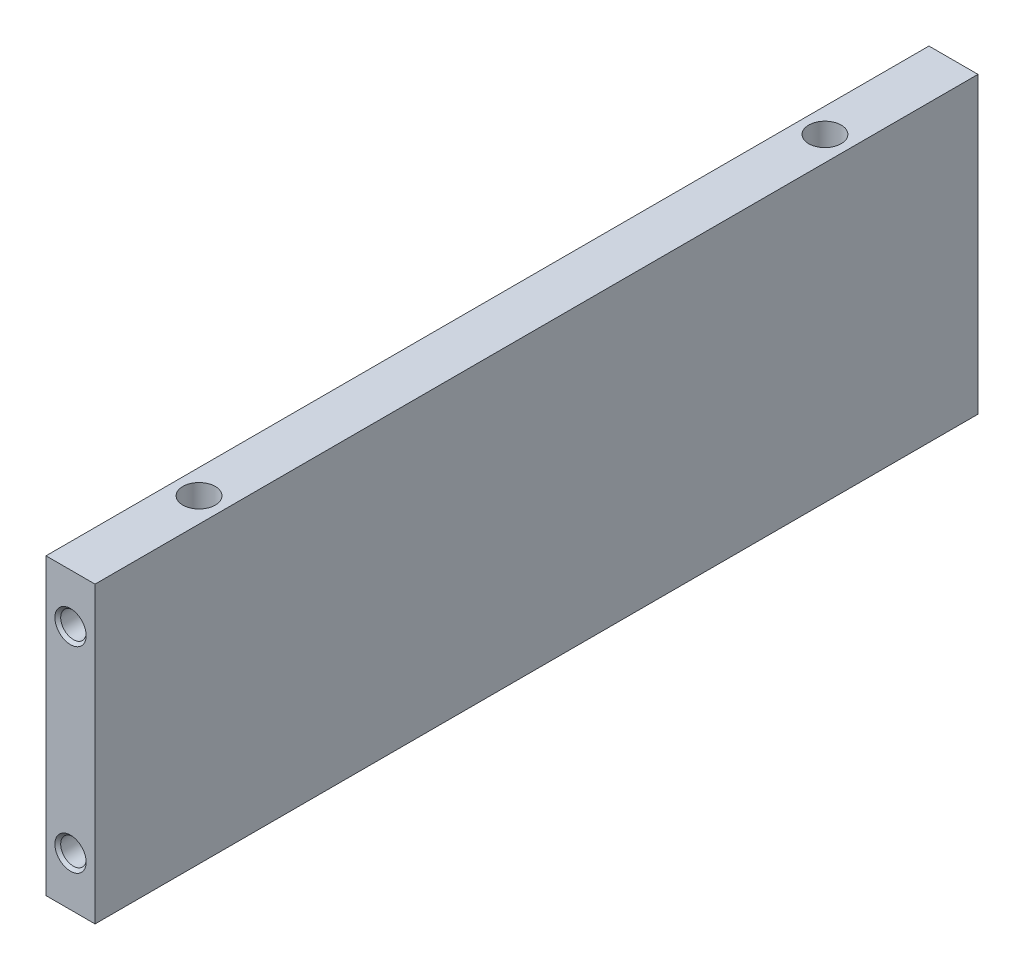
ISO-10303-21;
HEADER;
FILE_DESCRIPTION(('STEP AP214'),'2;1');
FILE_NAME('part.step','',(''),(''),'','','');
FILE_SCHEMA(('AUTOMOTIVE_DESIGN { 1 0 10303 214 1 1 1 1 }'));
ENDSEC;
DATA;
#1=APPLICATION_CONTEXT('core data for automotive mechanical design processes');
#2=APPLICATION_PROTOCOL_DEFINITION('international standard','automotive_design',2000,#1);
#3=PRODUCT_CONTEXT('',#1,'mechanical');
#4=PRODUCT('Part','Part','',(#3));
#5=PRODUCT_RELATED_PRODUCT_CATEGORY('part','',(#4));
#6=PRODUCT_DEFINITION_FORMATION('','',#4);
#7=PRODUCT_DEFINITION_CONTEXT('part definition',#1,'design');
#8=PRODUCT_DEFINITION('design','',#6,#7);
#9=PRODUCT_DEFINITION_SHAPE('','',#8);
#10=(LENGTH_UNIT() NAMED_UNIT(*) SI_UNIT(.MILLI.,.METRE.));
#11=(NAMED_UNIT(*) PLANE_ANGLE_UNIT() SI_UNIT($,.RADIAN.));
#12=(NAMED_UNIT(*) SI_UNIT($,.STERADIAN.) SOLID_ANGLE_UNIT());
#13=UNCERTAINTY_MEASURE_WITH_UNIT(LENGTH_MEASURE(1.E-05),#10,'distance_accuracy_value','');
#14=(GEOMETRIC_REPRESENTATION_CONTEXT(3) GLOBAL_UNCERTAINTY_ASSIGNED_CONTEXT((#13)) GLOBAL_UNIT_ASSIGNED_CONTEXT((#10,
#11,#12)) REPRESENTATION_CONTEXT('',''));
#15=CARTESIAN_POINT('',(0.,0.,0.));
#16=DIRECTION('',(0.,0.,1.));
#17=DIRECTION('',(1.,0.,0.));
#18=AXIS2_PLACEMENT_3D('',#15,#16,#17);
#19=CARTESIAN_POINT('',(3.175,19.05,-57.15));
#20=DIRECTION('',(1.,0.,0.));
#21=DIRECTION('',(0.,1.,0.));
#22=AXIS2_PLACEMENT_3D('',#19,#20,#21);
#23=PLANE('',#22);
#24=DIRECTION('',(0.,0.,1.));
#25=VECTOR('',#24,1.);
#26=CARTESIAN_POINT('',(3.175,19.05,-57.15));
#27=LINE('',#26,#25);
#28=CARTESIAN_POINT('',(3.175,19.05,-57.15));
#29=VERTEX_POINT('',#28);
#30=CARTESIAN_POINT('',(3.175,19.05,57.15));
#31=VERTEX_POINT('',#30);
#32=EDGE_CURVE('E54',#29,#31,#27,.T.);
#33=ORIENTED_EDGE('',*,*,#32,.T.);
#34=DIRECTION('',(0.,1.,0.));
#35=VECTOR('',#34,1.);
#36=CARTESIAN_POINT('',(3.175,19.05,57.15));
#37=LINE('',#36,#35);
#38=CARTESIAN_POINT('',(3.175,-19.05,57.15));
#39=VERTEX_POINT('',#38);
#40=EDGE_CURVE('E92',#39,#31,#37,.T.);
#41=ORIENTED_EDGE('',*,*,#40,.F.);
#42=DIRECTION('',(0.,0.,1.));
#43=VECTOR('',#42,1.);
#44=CARTESIAN_POINT('',(3.175,-19.05,-57.15));
#45=LINE('',#44,#43);
#46=CARTESIAN_POINT('',(3.175,-19.05,-57.15));
#47=VERTEX_POINT('',#46);
#48=EDGE_CURVE('E11',#47,#39,#45,.T.);
#49=ORIENTED_EDGE('',*,*,#48,.F.);
#50=DIRECTION('',(0.,1.,0.));
#51=VECTOR('',#50,1.);
#52=CARTESIAN_POINT('',(3.175,19.05,-57.15));
#53=LINE('',#52,#51);
#54=EDGE_CURVE('E93',#47,#29,#53,.T.);
#55=ORIENTED_EDGE('',*,*,#54,.T.);
#56=EDGE_LOOP('',(#33,#41,#49,#55));
#57=FACE_BOUND('',#56,.T.);
#58=ADVANCED_FACE('F51',(#57),#23,.T.);
#59=CARTESIAN_POINT('',(-3.175,-19.05,-57.15));
#60=DIRECTION('',(0.,-1.,0.));
#61=DIRECTION('',(0.,0.,-1.));
#62=AXIS2_PLACEMENT_3D('',#59,#60,#61);
#63=PLANE('',#62);
#64=CARTESIAN_POINT('',(0.,-19.05,40.513));
#65=DIRECTION('',(0.,1.,0.));
#66=DIRECTION('',(0.,0.,1.));
#67=AXIS2_PLACEMENT_3D('',#64,#65,#66);
#68=CIRCLE('',#67,2.1);
#69=CARTESIAN_POINT('',(0.,-19.05,42.613));
#70=VERTEX_POINT('',#69);
#71=EDGE_CURVE('E113',#70,#70,#68,.T.);
#72=ORIENTED_EDGE('',*,*,#71,.T.);
#73=EDGE_LOOP('',(#72));
#74=FACE_BOUND('',#73,.T.);
#75=CARTESIAN_POINT('',(0.,-19.05,-40.513));
#76=DIRECTION('',(0.,1.,0.));
#77=DIRECTION('',(0.,0.,1.));
#78=AXIS2_PLACEMENT_3D('',#75,#76,#77);
#79=CIRCLE('',#78,2.1);
#80=CARTESIAN_POINT('',(0.,-19.05,-38.413));
#81=VERTEX_POINT('',#80);
#82=EDGE_CURVE('E122',#81,#81,#79,.T.);
#83=ORIENTED_EDGE('',*,*,#82,.T.);
#84=EDGE_LOOP('',(#83));
#85=FACE_BOUND('',#84,.T.);
#86=ORIENTED_EDGE('',*,*,#48,.T.);
#87=DIRECTION('',(1.,0.,0.));
#88=VECTOR('',#87,1.);
#89=CARTESIAN_POINT('',(-3.175,-19.05,57.15));
#90=LINE('',#89,#88);
#91=CARTESIAN_POINT('',(-3.175,-19.05,57.15));
#92=VERTEX_POINT('',#91);
#93=EDGE_CURVE('E111',#92,#39,#90,.T.);
#94=ORIENTED_EDGE('',*,*,#93,.F.);
#95=DIRECTION('',(0.,0.,1.));
#96=VECTOR('',#95,1.);
#97=CARTESIAN_POINT('',(-3.175,-19.05,-57.15));
#98=LINE('',#97,#96);
#99=CARTESIAN_POINT('',(-3.175,-19.05,-57.15));
#100=VERTEX_POINT('',#99);
#101=EDGE_CURVE('E60',#100,#92,#98,.T.);
#102=ORIENTED_EDGE('',*,*,#101,.F.);
#103=DIRECTION('',(1.,0.,0.));
#104=VECTOR('',#103,1.);
#105=CARTESIAN_POINT('',(-3.175,-19.05,-57.15));
#106=LINE('',#105,#104);
#107=EDGE_CURVE('E99',#100,#47,#106,.T.);
#108=ORIENTED_EDGE('',*,*,#107,.T.);
#109=EDGE_LOOP('',(#86,#94,#102,#108));
#110=FACE_BOUND('',#109,.T.);
#111=ADVANCED_FACE('F271',(#74,#85,#110),#63,.T.);
#112=CARTESIAN_POINT('',(-3.175,19.05,-57.15));
#113=DIRECTION('',(-1.,0.,0.));
#114=DIRECTION('',(0.,-1.,0.));
#115=AXIS2_PLACEMENT_3D('',#112,#113,#114);
#116=PLANE('',#115);
#117=ORIENTED_EDGE('',*,*,#101,.T.);
#118=DIRECTION('',(0.,-1.,0.));
#119=VECTOR('',#118,1.);
#120=CARTESIAN_POINT('',(-3.175,19.05,57.15));
#121=LINE('',#120,#119);
#122=CARTESIAN_POINT('',(-3.175,19.05,57.15));
#123=VERTEX_POINT('',#122);
#124=EDGE_CURVE('E107',#123,#92,#121,.T.);
#125=ORIENTED_EDGE('',*,*,#124,.F.);
#126=DIRECTION('',(0.,0.,1.));
#127=VECTOR('',#126,1.);
#128=CARTESIAN_POINT('',(-3.175,19.05,-57.15));
#129=LINE('',#128,#127);
#130=CARTESIAN_POINT('',(-3.175,19.05,-57.15));
#131=VERTEX_POINT('',#130);
#132=EDGE_CURVE('E98',#131,#123,#129,.T.);
#133=ORIENTED_EDGE('',*,*,#132,.F.);
#134=DIRECTION('',(0.,-1.,0.));
#135=VECTOR('',#134,1.);
#136=CARTESIAN_POINT('',(-3.175,19.05,-57.15));
#137=LINE('',#136,#135);
#138=EDGE_CURVE('E134',#131,#100,#137,.T.);
#139=ORIENTED_EDGE('',*,*,#138,.T.);
#140=EDGE_LOOP('',(#117,#125,#133,#139));
#141=FACE_BOUND('',#140,.T.);
#142=ADVANCED_FACE('F275',(#141),#116,.T.);
#143=CARTESIAN_POINT('',(-3.175,19.05,-57.15));
#144=DIRECTION('',(0.,1.,0.));
#145=DIRECTION('',(0.,0.,1.));
#146=AXIS2_PLACEMENT_3D('',#143,#144,#145);
#147=PLANE('',#146);
#148=CARTESIAN_POINT('',(0.,19.05,40.513));
#149=DIRECTION('',(0.,1.,0.));
#150=DIRECTION('',(0.,0.,1.));
#151=AXIS2_PLACEMENT_3D('',#148,#149,#150);
#152=CIRCLE('',#151,2.1);
#153=CARTESIAN_POINT('',(0.,19.05,42.613));
#154=VERTEX_POINT('',#153);
#155=EDGE_CURVE('E119',#154,#154,#152,.T.);
#156=ORIENTED_EDGE('',*,*,#155,.F.);
#157=EDGE_LOOP('',(#156));
#158=FACE_BOUND('',#157,.T.);
#159=CARTESIAN_POINT('',(0.,19.05,-40.513));
#160=DIRECTION('',(0.,1.,0.));
#161=DIRECTION('',(0.,0.,1.));
#162=AXIS2_PLACEMENT_3D('',#159,#160,#161);
#163=CIRCLE('',#162,2.1);
#164=CARTESIAN_POINT('',(0.,19.05,-38.413));
#165=VERTEX_POINT('',#164);
#166=EDGE_CURVE('E167',#165,#165,#163,.T.);
#167=ORIENTED_EDGE('',*,*,#166,.F.);
#168=EDGE_LOOP('',(#167));
#169=FACE_BOUND('',#168,.T.);
#170=ORIENTED_EDGE('',*,*,#132,.T.);
#171=DIRECTION('',(-1.,0.,0.));
#172=VECTOR('',#171,1.);
#173=CARTESIAN_POINT('',(-3.175,19.05,57.15));
#174=LINE('',#173,#172);
#175=EDGE_CURVE('E101',#31,#123,#174,.T.);
#176=ORIENTED_EDGE('',*,*,#175,.F.);
#177=ORIENTED_EDGE('',*,*,#32,.F.);
#178=DIRECTION('',(-1.,0.,0.));
#179=VECTOR('',#178,1.);
#180=CARTESIAN_POINT('',(-3.175,19.05,-57.15));
#181=LINE('',#180,#179);
#182=EDGE_CURVE('E131',#29,#131,#181,.T.);
#183=ORIENTED_EDGE('',*,*,#182,.T.);
#184=EDGE_LOOP('',(#170,#176,#177,#183));
#185=FACE_BOUND('',#184,.T.);
#186=ADVANCED_FACE('F102',(#158,#169,#185),#147,.T.);
#187=CARTESIAN_POINT('',(0.,0.,-57.15));
#188=DIRECTION('',(0.,0.,1.));
#189=DIRECTION('',(1.,0.,0.));
#190=AXIS2_PLACEMENT_3D('',#187,#188,#189);
#191=PLANE('',#190);
#192=CARTESIAN_POINT('',(0.,12.7,-57.15));
#193=DIRECTION('',(0.,0.,-1.));
#194=DIRECTION('',(-1.,0.,0.));
#195=AXIS2_PLACEMENT_3D('',#192,#193,#194);
#196=CIRCLE('',#195,2.025);
#197=CARTESIAN_POINT('',(-2.025,12.7,-57.15));
#198=VERTEX_POINT('',#197);
#199=EDGE_CURVE('E242',#198,#198,#196,.T.);
#200=ORIENTED_EDGE('',*,*,#199,.F.);
#201=EDGE_LOOP('',(#200));
#202=FACE_BOUND('',#201,.T.);
#203=CARTESIAN_POINT('',(0.,-12.7,-57.15));
#204=DIRECTION('',(0.,0.,-1.));
#205=DIRECTION('',(-1.,0.,0.));
#206=AXIS2_PLACEMENT_3D('',#203,#204,#205);
#207=CIRCLE('',#206,2.025);
#208=CARTESIAN_POINT('',(-2.025,-12.7,-57.15));
#209=VERTEX_POINT('',#208);
#210=EDGE_CURVE('E224',#209,#209,#207,.T.);
#211=ORIENTED_EDGE('',*,*,#210,.F.);
#212=EDGE_LOOP('',(#211));
#213=FACE_BOUND('',#212,.T.);
#214=ORIENTED_EDGE('',*,*,#54,.F.);
#215=ORIENTED_EDGE('',*,*,#107,.F.);
#216=ORIENTED_EDGE('',*,*,#138,.F.);
#217=ORIENTED_EDGE('',*,*,#182,.F.);
#218=EDGE_LOOP('',(#214,#215,#216,#217));
#219=FACE_BOUND('',#218,.T.);
#220=ADVANCED_FACE('F285',(#202,#213,#219),#191,.F.);
#221=CARTESIAN_POINT('',(0.,0.,57.15));
#222=DIRECTION('',(0.,0.,1.));
#223=DIRECTION('',(1.,0.,0.));
#224=AXIS2_PLACEMENT_3D('',#221,#222,#223);
#225=PLANE('',#224);
#226=CARTESIAN_POINT('',(0.,12.7,57.15));
#227=DIRECTION('',(0.,0.,1.));
#228=DIRECTION('',(1.,0.,0.));
#229=AXIS2_PLACEMENT_3D('',#226,#227,#228);
#230=CIRCLE('',#229,2.025);
#231=CARTESIAN_POINT('',(2.025,12.7,57.15));
#232=VERTEX_POINT('',#231);
#233=EDGE_CURVE('E206',#232,#232,#230,.T.);
#234=ORIENTED_EDGE('',*,*,#233,.F.);
#235=EDGE_LOOP('',(#234));
#236=FACE_BOUND('',#235,.T.);
#237=CARTESIAN_POINT('',(0.,-12.7,57.15));
#238=DIRECTION('',(0.,0.,1.));
#239=DIRECTION('',(1.,0.,0.));
#240=AXIS2_PLACEMENT_3D('',#237,#238,#239);
#241=CIRCLE('',#240,2.025);
#242=CARTESIAN_POINT('',(2.025,-12.7,57.15));
#243=VERTEX_POINT('',#242);
#244=EDGE_CURVE('E188',#243,#243,#241,.T.);
#245=ORIENTED_EDGE('',*,*,#244,.F.);
#246=EDGE_LOOP('',(#245));
#247=FACE_BOUND('',#246,.T.);
#248=ORIENTED_EDGE('',*,*,#40,.T.);
#249=ORIENTED_EDGE('',*,*,#175,.T.);
#250=ORIENTED_EDGE('',*,*,#124,.T.);
#251=ORIENTED_EDGE('',*,*,#93,.T.);
#252=EDGE_LOOP('',(#248,#249,#250,#251));
#253=FACE_BOUND('',#252,.T.);
#254=ADVANCED_FACE('F110',(#236,#247,#253),#225,.T.);
#255=CARTESIAN_POINT('',(0.,-19.05,-40.513));
#256=DIRECTION('',(0.,1.,0.));
#257=DIRECTION('',(0.,0.,1.));
#258=AXIS2_PLACEMENT_3D('',#255,#256,#257);
#259=CYLINDRICAL_SURFACE('',#258,2.1);
#260=CARTESIAN_POINT('',(-1.65,12.7,-41.8120381056767));
#261=CARTESIAN_POINT('',(-1.64999150232253,12.7633907031737,-41.8120565708423));
#262=CARTESIAN_POINT('',(-1.64630541944785,12.8268781383126,-41.8167734895458));
#263=CARTESIAN_POINT('',(-1.63188621414006,12.9518827753618,-41.8347663632729));
#264=CARTESIAN_POINT('',(-1.6211295493421,13.0133926726387,-41.8480709091701));
#265=CARTESIAN_POINT('',(-1.58869701304661,13.1530488771155,-41.8866297412798));
#266=CARTESIAN_POINT('',(-1.5645783687287,13.2299177508478,-41.9143875294822));
#267=CARTESIAN_POINT('',(-1.50673755099663,13.3771525366048,-41.9764019107869));
#268=CARTESIAN_POINT('',(-1.47298961775175,13.4475003257843,-42.0106758524145));
#269=CARTESIAN_POINT('',(-1.38411832769514,13.6040423341345,-42.0938350740011));
#270=CARTESIAN_POINT('',(-1.32561785872244,13.6877527092149,-42.1437959226138));
#271=CARTESIAN_POINT('',(-1.19394013201228,13.8434036827777,-42.24253553492));
#272=CARTESIAN_POINT('',(-1.12077463856696,13.9153536320215,-42.2913152112187));
#273=CARTESIAN_POINT('',(-0.975495005805126,14.0333812365183,-42.3741851132311));
#274=CARTESIAN_POINT('',(-0.905854798310287,14.0817753557718,-42.4093006712452));
#275=CARTESIAN_POINT('',(-0.7577844041816,14.1681903760097,-42.4731620444215));
#276=CARTESIAN_POINT('',(-0.679367851793273,14.2062270603499,-42.5019175387774));
#277=CARTESIAN_POINT('',(-0.528017404110454,14.2649961623543,-42.5468179099653));
#278=CARTESIAN_POINT('',(-0.456155802714711,14.2875078344728,-42.5642338935184));
#279=CARTESIAN_POINT('',(-0.308663596325365,14.3226403395103,-42.5915422869353));
#280=CARTESIAN_POINT('',(-0.233035031158962,14.3352664648751,-42.6014387224712));
#281=CARTESIAN_POINT('',(-0.0798699655767393,14.3498652688319,-42.6128891665015));
#282=CARTESIAN_POINT('',(-0.00232818004367965,14.3518040720613,-42.6144166480195));
#283=CARTESIAN_POINT('',(0.151953996536498,14.3448020790065,-42.608917281436));
#284=CARTESIAN_POINT('',(0.228694322819096,14.3358604102471,-42.6018897473312));
#285=CARTESIAN_POINT('',(0.375312888043239,14.3083943252109,-42.5804534122505));
#286=CARTESIAN_POINT('',(0.445342782688923,14.2903659450119,-42.5664270340302));
#287=CARTESIAN_POINT('',(0.58108275797318,14.2459456804528,-42.5322196008011));
#288=CARTESIAN_POINT('',(0.646791780509265,14.2195517566657,-42.5120370450293));
#289=CARTESIAN_POINT('',(0.779222926407902,14.1564407560638,-42.4644726926839));
#290=CARTESIAN_POINT('',(0.845389222472605,14.1189552835731,-42.4365727852921));
#291=CARTESIAN_POINT('',(0.970656409600608,14.0363991895378,-42.3765076565387));
#292=CARTESIAN_POINT('',(1.02975274570742,13.9913237225319,-42.3443397132573));
#293=CARTESIAN_POINT('',(1.15192072621684,13.884666766519,-42.2705979726863));
#294=CARTESIAN_POINT('',(1.2133394358136,13.8215943370514,-42.2284449226687));
#295=CARTESIAN_POINT('',(1.32533908018869,13.6867489499515,-42.1434647267489));
#296=CARTESIAN_POINT('',(1.3759088066046,13.6149671130918,-42.1006369323038));
#297=CARTESIAN_POINT('',(1.45976152704553,13.4729631229397,-42.0235945823214));
#298=CARTESIAN_POINT('',(1.49444438997018,13.4037820639662,-41.9889887308105));
#299=CARTESIAN_POINT('',(1.55441331240958,13.2589399207844,-41.9256903320215));
#300=CARTESIAN_POINT('',(1.57972010240787,13.1832935929339,-41.8969848025154));
#301=CARTESIAN_POINT('',(1.61414085002842,13.0472091085285,-41.8565257459194));
#302=CARTESIAN_POINT('',(1.62578097079893,12.9881689010386,-41.8422884088271));
#303=CARTESIAN_POINT('',(1.64255399692266,12.8678865722324,-41.821511149724));
#304=CARTESIAN_POINT('',(1.64769972998323,12.8066490380408,-41.8149560555916));
#305=CARTESIAN_POINT('',(1.65107138240099,12.6834019565507,-41.8106802990477));
#306=CARTESIAN_POINT('',(1.64926867496375,12.6213902668846,-41.8129961838294));
#307=CARTESIAN_POINT('',(1.63884970070072,12.4988284145099,-41.826101121331));
#308=CARTESIAN_POINT('',(1.63022334690548,12.4382805523469,-41.8369027177854));
#309=CARTESIAN_POINT('',(1.60338456249353,12.30286382475,-41.8693591127881));
#310=CARTESIAN_POINT('',(1.58311204846238,12.2289594944631,-41.8932585266264));
#311=CARTESIAN_POINT('',(1.53370076481959,12.086845846436,-41.9479640012219));
#312=CARTESIAN_POINT('',(1.50453477145501,12.0186548464198,-41.978791191243));
#313=CARTESIAN_POINT('',(1.42500843942745,11.8619242627284,-42.0568785540598));
#314=CARTESIAN_POINT('',(1.37083596883987,11.7761404865441,-42.1057832520841));
#315=CARTESIAN_POINT('',(1.24797292162134,11.6159152908317,-42.2037879721822));
#316=CARTESIAN_POINT('',(1.17928526066674,11.5414715985733,-42.2528879530889));
#317=CARTESIAN_POINT('',(1.0393011483464,11.4155546682969,-42.3393504756976));
#318=CARTESIAN_POINT('',(0.970005610597323,11.3623096578053,-42.3773603158094));
#319=CARTESIAN_POINT('',(0.82170315249813,11.2664487811213,-42.4472946816617));
#320=CARTESIAN_POINT('',(0.742712885609013,11.2238150582481,-42.4792294089619));
#321=CARTESIAN_POINT('',(0.590787802221573,11.1575714513305,-42.5294843212359));
#322=CARTESIAN_POINT('',(0.519203875806985,11.1319396738409,-42.5492080861349));
#323=CARTESIAN_POINT('',(0.371625061847246,11.0905732974517,-42.5812314394734));
#324=CARTESIAN_POINT('',(0.295632711102596,11.0748330670365,-42.5935352521238));
#325=CARTESIAN_POINT('',(0.140959211201724,11.0541751007247,-42.6097111569269));
#326=CARTESIAN_POINT('',(0.0622682663417694,11.0493022619967,-42.6135482693555));
#327=CARTESIAN_POINT('',(-0.0949302176673043,11.0508593787594,-42.6123247283874));
#328=CARTESIAN_POINT('',(-0.173437766871315,11.0572886993054,-42.6072645748307));
#329=CARTESIAN_POINT('',(-0.3225702794605,11.0801966543102,-42.5893470512292));
#330=CARTESIAN_POINT('',(-0.393371744151163,11.0959764142218,-42.5770322535849));
#331=CARTESIAN_POINT('',(-0.530991946642845,11.1361296845671,-42.545985170046));
#332=CARTESIAN_POINT('',(-0.597809716501815,11.1605052737123,-42.527251331879));
#333=CARTESIAN_POINT('',(-0.73158846101514,11.2191083842408,-42.4828083092122));
#334=CARTESIAN_POINT('',(-0.79811831489105,11.2539763663191,-42.4566554444437));
#335=CARTESIAN_POINT('',(-0.924472492076905,11.3312979065058,-42.399838116379));
#336=CARTESIAN_POINT('',(-0.984293520428327,11.3737551656737,-42.3691714531348));
#337=CARTESIAN_POINT('',(-1.10796891924142,11.4742567829222,-42.2986136271374));
#338=CARTESIAN_POINT('',(-1.17030553583476,11.533724608473,-42.258094028955));
#339=CARTESIAN_POINT('',(-1.28472853787868,11.6610979098706,-42.1756629615147));
#340=CARTESIAN_POINT('',(-1.33680152106845,11.7290142315781,-42.1337497548105));
#341=CARTESIAN_POINT('',(-1.42801952027212,11.8693805786131,-42.0538597093073));
#342=CARTESIAN_POINT('',(-1.46767106492228,11.9414481146506,-42.015790582789));
#343=CARTESIAN_POINT('',(-1.5365395713837,12.0930049093589,-41.9452934841617));
#344=CARTESIAN_POINT('',(-1.56577545027582,12.1724803788512,-41.9128553405145));
#345=CARTESIAN_POINT('',(-1.60539413851652,12.3141056947801,-41.8670118378246));
#346=CARTESIAN_POINT('',(-1.61879216518679,12.374489444246,-41.8508146535357));
#347=CARTESIAN_POINT('',(-1.6387476004762,12.4978412125655,-41.8263048398188));
#348=CARTESIAN_POINT('',(-1.64533080610612,12.560798541002,-41.8179624874273));
#349=CARTESIAN_POINT('',(-1.64941979861355,12.6493642059234,-41.8127732868244));
#350=CARTESIAN_POINT('',(-1.65000339496035,12.6746743831103,-41.8120307285427));
#351=CARTESIAN_POINT('',(-1.65,12.7,-41.8120381056767));
#352=B_SPLINE_CURVE_WITH_KNOTS('',3,(#260,#261,#262,#263,#264,#265,#266,#267,#268,#269,#270,
#271,#272,#273,#274,#275,#276,#277,#278,#279,#280,#281,#282,#283,#284,#285,#286,#287,#288,#289,
#290,#291,#292,#293,#294,#295,#296,#297,#298,#299,#300,#301,#302,#303,#304,#305,#306,#307,#308,
#309,#310,#311,#312,#313,#314,#315,#316,#317,#318,#319,#320,#321,#322,#323,#324,#325,#326,#327,
#328,#329,#330,#331,#332,#333,#334,#335,#336,#337,#338,#339,#340,#341,#342,#343,#344,#345,#346,
#347,#348,#349,#350,#351),.UNSPECIFIED.,.T.,.F.,(4,2,2,2,2,2,2,2,2,2,2,2,2,2,2,2,2,2,2,2,2,2,2,
2,2,2,2,2,2,2,2,2,2,2,2,2,2,2,2,2,2,2,2,2,2,4),(0.,0.190084746348346,0.380805630996544,
0.6350098053961,0.889900495479767,1.22933923087683,1.56850675033124,1.84282282531256,
2.11671850942991,2.3476099745084,2.57837774205232,2.80987655016042,3.04139392274665,
3.2614560345303,3.48157183634271,3.7237000741056,3.96598347697074,4.25774733977163,
4.54981119499563,4.80338572611547,5.05639621034818,5.24119722181751,5.42563264033953,
5.61082872264334,5.79629908148735,6.03578290391508,6.27600729540196,6.61221375790708,
6.94835275047202,7.23314990663923,7.51746451546374,7.75213593415367,7.986673626959,
8.22217849970153,8.45767014242528,8.6774548818802,8.89729280791383,9.13502647860396,
9.37287640265283,9.65746971154067,9.94243221578962,10.2135011668675,10.4840752582166,
10.6751900056936,10.8655786268932,10.941520574554),.UNSPECIFIED.);
#353=CARTESIAN_POINT('',(-1.65,12.7,-41.8120381056767));
#354=VERTEX_POINT('',#353);
#355=EDGE_CURVE('E230',#354,#354,#352,.T.);
#356=ORIENTED_EDGE('',*,*,#355,.T.);
#357=EDGE_LOOP('',(#356));
#358=FACE_BOUND('',#357,.T.);
#359=CARTESIAN_POINT('',(-1.65,-12.7,-41.8120381056766));
#360=CARTESIAN_POINT('',(-1.64999150232253,-12.6366092968263,-41.8120565708423));
#361=CARTESIAN_POINT('',(-1.64630541944785,-12.5731218616874,-41.8167734895458));
#362=CARTESIAN_POINT('',(-1.63188621414007,-12.4481172246382,-41.8347663632729));
#363=CARTESIAN_POINT('',(-1.6211295493421,-12.3866073273613,-41.8480709091701));
#364=CARTESIAN_POINT('',(-1.58869701304661,-12.2469511228845,-41.8866297412798));
#365=CARTESIAN_POINT('',(-1.5645783687287,-12.1700822491522,-41.9143875294822));
#366=CARTESIAN_POINT('',(-1.50673755099663,-12.0228474633952,-41.9764019107869));
#367=CARTESIAN_POINT('',(-1.47298961775175,-11.9524996742157,-42.0106758524145));
#368=CARTESIAN_POINT('',(-1.38411832769514,-11.7959576658655,-42.0938350740011));
#369=CARTESIAN_POINT('',(-1.32561785872243,-11.7122472907851,-42.1437959226138));
#370=CARTESIAN_POINT('',(-1.19394013201228,-11.5565963172223,-42.24253553492));
#371=CARTESIAN_POINT('',(-1.12077463856696,-11.4846463679785,-42.2913152112187));
#372=CARTESIAN_POINT('',(-0.97549500580512,-11.3666187634817,-42.3741851132311));
#373=CARTESIAN_POINT('',(-0.905854798310279,-11.3182246442282,-42.4093006712452));
#374=CARTESIAN_POINT('',(-0.757784404181593,-11.2318096239903,-42.4731620444215));
#375=CARTESIAN_POINT('',(-0.679367851793268,-11.1937729396501,-42.5019175387774));
#376=CARTESIAN_POINT('',(-0.52801740411045,-11.1350038376457,-42.5468179099653));
#377=CARTESIAN_POINT('',(-0.456155802714705,-11.1124921655272,-42.5642338935184));
#378=CARTESIAN_POINT('',(-0.308663596325359,-11.0773596604897,-42.5915422869353));
#379=CARTESIAN_POINT('',(-0.233035031158957,-11.0647335351249,-42.6014387224712));
#380=CARTESIAN_POINT('',(-0.079869965576734,-11.0501347311681,-42.6128891665015));
#381=CARTESIAN_POINT('',(-0.00232818004367465,-11.0481959279387,-42.6144166480195));
#382=CARTESIAN_POINT('',(0.151953996536503,-11.0551979209935,-42.608917281436));
#383=CARTESIAN_POINT('',(0.2286943228191,-11.0641395897529,-42.6018897473312));
#384=CARTESIAN_POINT('',(0.375312888043241,-11.0916056747891,-42.5804534122505));
#385=CARTESIAN_POINT('',(0.445342782688924,-11.1096340549881,-42.5664270340302));
#386=CARTESIAN_POINT('',(0.581082757973181,-11.1540543195472,-42.5322196008011));
#387=CARTESIAN_POINT('',(0.646791780509267,-11.1804482433343,-42.5120370450293));
#388=CARTESIAN_POINT('',(0.779222926407905,-11.2435592439362,-42.4644726926839));
#389=CARTESIAN_POINT('',(0.845389222472608,-11.2810447164269,-42.4365727852921));
#390=CARTESIAN_POINT('',(0.970656409600611,-11.3636008104622,-42.3765076565387));
#391=CARTESIAN_POINT('',(1.02975274570743,-11.4086762774681,-42.3443397132573));
#392=CARTESIAN_POINT('',(1.15192072621685,-11.515333233481,-42.2705979726863));
#393=CARTESIAN_POINT('',(1.2133394358136,-11.5784056629486,-42.2284449226687));
#394=CARTESIAN_POINT('',(1.32533908018869,-11.7132510500485,-42.1434647267489));
#395=CARTESIAN_POINT('',(1.3759088066046,-11.7850328869082,-42.1006369323038));
#396=CARTESIAN_POINT('',(1.45976152704553,-11.9270368770603,-42.0235945823214));
#397=CARTESIAN_POINT('',(1.49444438997018,-11.9962179360338,-41.9889887308105));
#398=CARTESIAN_POINT('',(1.55441331240958,-12.1410600792156,-41.9256903320215));
#399=CARTESIAN_POINT('',(1.57972010240787,-12.2167064070661,-41.8969848025154));
#400=CARTESIAN_POINT('',(1.61414085002842,-12.3527908914715,-41.8565257459194));
#401=CARTESIAN_POINT('',(1.62578097079892,-12.4118310989614,-41.8422884088271));
#402=CARTESIAN_POINT('',(1.64255399692266,-12.5321134277676,-41.821511149724));
#403=CARTESIAN_POINT('',(1.64769972998322,-12.5933509619593,-41.8149560555916));
#404=CARTESIAN_POINT('',(1.65107138240099,-12.7165980434493,-41.8106802990477));
#405=CARTESIAN_POINT('',(1.64926867496375,-12.7786097331154,-41.8129961838294));
#406=CARTESIAN_POINT('',(1.63884970070072,-12.9011715854901,-41.826101121331));
#407=CARTESIAN_POINT('',(1.63022334690548,-12.9617194476531,-41.8369027177854));
#408=CARTESIAN_POINT('',(1.60338456249353,-13.0971361752501,-41.8693591127881));
#409=CARTESIAN_POINT('',(1.58311204846238,-13.1710405055369,-41.8932585266264));
#410=CARTESIAN_POINT('',(1.53370076481959,-13.313154153564,-41.9479640012219));
#411=CARTESIAN_POINT('',(1.504534771455,-13.3813451535802,-41.978791191243));
#412=CARTESIAN_POINT('',(1.42500843942745,-13.5380757372716,-42.0568785540598));
#413=CARTESIAN_POINT('',(1.37083596883987,-13.6238595134559,-42.1057832520841));
#414=CARTESIAN_POINT('',(1.24797292162134,-13.7840847091683,-42.2037879721822));
#415=CARTESIAN_POINT('',(1.17928526066674,-13.8585284014267,-42.2528879530889));
#416=CARTESIAN_POINT('',(1.0393011483464,-13.9844453317031,-42.3393504756976));
#417=CARTESIAN_POINT('',(0.970005610597324,-14.0376903421947,-42.3773603158094));
#418=CARTESIAN_POINT('',(0.821703152498131,-14.1335512188787,-42.4472946816617));
#419=CARTESIAN_POINT('',(0.742712885609014,-14.1761849417519,-42.4792294089619));
#420=CARTESIAN_POINT('',(0.590787802221574,-14.2424285486695,-42.5294843212359));
#421=CARTESIAN_POINT('',(0.519203875806986,-14.2680603261591,-42.5492080861349));
#422=CARTESIAN_POINT('',(0.371625061847247,-14.3094267025483,-42.5812314394734));
#423=CARTESIAN_POINT('',(0.295632711102597,-14.3251669329635,-42.5935352521238));
#424=CARTESIAN_POINT('',(0.140959211201724,-14.3458248992753,-42.6097111569269));
#425=CARTESIAN_POINT('',(0.0622682663417701,-14.3506977380033,-42.6135482693555));
#426=CARTESIAN_POINT('',(-0.0949302176673037,-14.3491406212406,-42.6123247283874));
#427=CARTESIAN_POINT('',(-0.173437766871314,-14.3427113006946,-42.6072645748307));
#428=CARTESIAN_POINT('',(-0.3225702794605,-14.3198033456898,-42.5893470512292));
#429=CARTESIAN_POINT('',(-0.393371744151165,-14.3040235857782,-42.5770322535849));
#430=CARTESIAN_POINT('',(-0.530991946642847,-14.2638703154329,-42.545985170046));
#431=CARTESIAN_POINT('',(-0.597809716501816,-14.2394947262877,-42.527251331879));
#432=CARTESIAN_POINT('',(-0.73158846101514,-14.1808916157592,-42.4828083092122));
#433=CARTESIAN_POINT('',(-0.79811831489105,-14.1460236336809,-42.4566554444437));
#434=CARTESIAN_POINT('',(-0.924472492076905,-14.0687020934943,-42.399838116379));
#435=CARTESIAN_POINT('',(-0.984293520428328,-14.0262448343263,-42.3691714531348));
#436=CARTESIAN_POINT('',(-1.10796891924142,-13.9257432170778,-42.2986136271374));
#437=CARTESIAN_POINT('',(-1.17030553583476,-13.866275391527,-42.258094028955));
#438=CARTESIAN_POINT('',(-1.28472853787868,-13.7389020901294,-42.1756629615147));
#439=CARTESIAN_POINT('',(-1.33680152106845,-13.6709857684219,-42.1337497548105));
#440=CARTESIAN_POINT('',(-1.42801952027212,-13.5306194213869,-42.0538597093073));
#441=CARTESIAN_POINT('',(-1.46767106492229,-13.4585518853494,-42.015790582789));
#442=CARTESIAN_POINT('',(-1.53653957138371,-13.3069950906411,-41.9452934841617));
#443=CARTESIAN_POINT('',(-1.56577545027582,-13.2275196211487,-41.9128553405145));
#444=CARTESIAN_POINT('',(-1.60539413851652,-13.0858943052199,-41.8670118378246));
#445=CARTESIAN_POINT('',(-1.61879216518679,-13.025510555754,-41.8508146535357));
#446=CARTESIAN_POINT('',(-1.6387476004762,-12.9021587874345,-41.8263048398188));
#447=CARTESIAN_POINT('',(-1.64533080610613,-12.839201458998,-41.8179624874273));
#448=CARTESIAN_POINT('',(-1.64941979861355,-12.7506357940766,-41.8127732868244));
#449=CARTESIAN_POINT('',(-1.65000339496035,-12.7253256168897,-41.8120307285427));
#450=CARTESIAN_POINT('',(-1.65,-12.7,-41.8120381056766));
#451=B_SPLINE_CURVE_WITH_KNOTS('',3,(#359,#360,#361,#362,#363,#364,#365,#366,#367,#368,#369,
#370,#371,#372,#373,#374,#375,#376,#377,#378,#379,#380,#381,#382,#383,#384,#385,#386,#387,#388,
#389,#390,#391,#392,#393,#394,#395,#396,#397,#398,#399,#400,#401,#402,#403,#404,#405,#406,#407,
#408,#409,#410,#411,#412,#413,#414,#415,#416,#417,#418,#419,#420,#421,#422,#423,#424,#425,#426,
#427,#428,#429,#430,#431,#432,#433,#434,#435,#436,#437,#438,#439,#440,#441,#442,#443,#444,#445,
#446,#447,#448,#449,#450),.UNSPECIFIED.,.T.,.F.,(4,2,2,2,2,2,2,2,2,2,2,2,2,2,2,2,2,2,2,2,2,2,2,
2,2,2,2,2,2,2,2,2,2,2,2,2,2,2,2,2,2,2,2,2,2,4),(0.,0.190084746348344,0.380805630996544,
0.635009805396104,0.889900495479771,1.22933923087684,1.56850675033126,1.84282282531257,
2.11671850942992,2.3476099745084,2.57837774205233,2.80987655016043,3.04139392274666,
3.26145603453031,3.48157183634271,3.7237000741056,3.96598347697075,4.25774733977164,
4.54981119499563,4.80338572611547,5.05639621034818,5.24119722181751,5.42563264033953,
5.61082872264334,5.79629908148735,6.03578290391508,6.27600729540196,6.61221375790707,
6.94835275047201,7.23314990663922,7.51746451546374,7.75213593415367,7.986673626959,
8.22217849970152,8.45767014242528,8.67745488188019,8.89729280791383,9.13502647860396,
9.37287640265282,9.65746971154067,9.94243221578962,10.2135011668675,10.4840752582166,
10.6751900056936,10.8655786268932,10.941520574554),.UNSPECIFIED.);
#452=CARTESIAN_POINT('',(-1.65,-12.7,-41.8120381056766));
#453=VERTEX_POINT('',#452);
#454=EDGE_CURVE('E212',#453,#453,#451,.T.);
#455=ORIENTED_EDGE('',*,*,#454,.T.);
#456=EDGE_LOOP('',(#455));
#457=FACE_BOUND('',#456,.T.);
#458=ORIENTED_EDGE('',*,*,#82,.F.);
#459=EDGE_LOOP('',(#458));
#460=FACE_BOUND('',#459,.T.);
#461=ORIENTED_EDGE('',*,*,#166,.T.);
#462=EDGE_LOOP('',(#461));
#463=FACE_BOUND('',#462,.T.);
#464=ADVANCED_FACE('F297',(#358,#457,#460,#463),#259,.F.);
#465=CARTESIAN_POINT('',(0.,-19.05,40.513));
#466=DIRECTION('',(0.,1.,0.));
#467=DIRECTION('',(0.,0.,1.));
#468=AXIS2_PLACEMENT_3D('',#465,#466,#467);
#469=CYLINDRICAL_SURFACE('',#468,2.1);
#470=CARTESIAN_POINT('',(0.,11.05,42.613));
#471=CARTESIAN_POINT('',(0.079600191721892,11.0500063854919,42.6129938180354));
#472=CARTESIAN_POINT('',(0.159308770499117,11.055807247544,42.6084276883457));
#473=CARTESIAN_POINT('',(0.316170572494336,11.0786270272923,42.590571175364));
#474=CARTESIAN_POINT('',(0.393318112451336,11.0956693436557,42.5772625952266));
#475=CARTESIAN_POINT('',(0.54236813503901,11.1397625247728,42.5431838207728));
#476=CARTESIAN_POINT('',(0.614300091198767,11.166750872655,42.5224602573362));
#477=CARTESIAN_POINT('',(0.752077362908827,11.2294161337021,42.4750649728783));
#478=CARTESIAN_POINT('',(0.817922465170861,11.2650933511729,42.4483930435333));
#479=CARTESIAN_POINT('',(0.964068401518121,11.3572928882193,42.3809013584246));
#480=CARTESIAN_POINT('',(1.04169930716527,11.4167812548436,42.3383511025782));
#481=CARTESIAN_POINT('',(1.18434758790923,11.5470916136396,42.2492096979225));
#482=CARTESIAN_POINT('',(1.24932779180486,11.6179459217883,42.2026072060636));
#483=CARTESIAN_POINT('',(1.36703855627689,11.7709276149308,42.1089106940927));
#484=CARTESIAN_POINT('',(1.41957731068858,11.8532039041822,42.0618193769498));
#485=CARTESIAN_POINT('',(1.51022360695895,12.0281562887462,41.9735438125059));
#486=CARTESIAN_POINT('',(1.54838104572859,12.1207949524506,41.932339454929));
#487=CARTESIAN_POINT('',(1.59570742473321,12.2759597434192,41.8784456106442));
#488=CARTESIAN_POINT('',(1.61034132688087,12.33514299849,41.8610050660711));
#489=CARTESIAN_POINT('',(1.63306902060523,12.4563429230465,41.8333819563485));
#490=CARTESIAN_POINT('',(1.64117835945663,12.5183524826106,41.8231821442496));
#491=CARTESIAN_POINT('',(1.65027043260621,12.6442345305078,41.8117189642637));
#492=CARTESIAN_POINT('',(1.65119930381098,12.7081174972858,41.8105231400377));
#493=CARTESIAN_POINT('',(1.6456926992374,12.8350716799121,41.8174959045594));
#494=CARTESIAN_POINT('',(1.63924962574396,12.8981419904169,41.8256741544836));
#495=CARTESIAN_POINT('',(1.61780178892174,13.0326537876678,41.8520461374508));
#496=CARTESIAN_POINT('',(1.60146944956729,13.1035695220296,41.8717722751562));
#497=CARTESIAN_POINT('',(1.5606076116453,13.2405008148638,41.9185121954729));
#498=CARTESIAN_POINT('',(1.53605491655817,13.3065018532401,41.9455465586728));
#499=CARTESIAN_POINT('',(1.46707205028577,13.4617828071443,42.016699944238));
#500=CARTESIAN_POINT('',(1.41866360318922,13.5482618078658,42.0630503344367));
#501=CARTESIAN_POINT('',(1.30792828658772,13.7106886130705,42.1575852872768));
#502=CARTESIAN_POINT('',(1.24558322317743,13.786622439078,42.2057721785869));
#503=CARTESIAN_POINT('',(1.10598968758157,13.9285683189905,42.3001858412893));
#504=CARTESIAN_POINT('',(1.02847507323562,13.9943588168815,42.3463563033235));
#505=CARTESIAN_POINT('',(0.859952779591859,14.1119006986825,42.4311554596762));
#506=CARTESIAN_POINT('',(0.768983754166374,14.1636911369481,42.4698050478195));
#507=CARTESIAN_POINT('',(0.603780342157008,14.2373888904257,42.5256289826309));
#508=CARTESIAN_POINT('',(0.532466411604607,14.2636056160884,42.5457770886972));
#509=CARTESIAN_POINT('',(0.385324591087874,14.3061987466362,42.5787177206038));
#510=CARTESIAN_POINT('',(0.309500190789622,14.3225826528998,42.5915158533574));
#511=CARTESIAN_POINT('',(0.154999735900791,14.3445628761322,42.6087193945145));
#512=CARTESIAN_POINT('',(0.0763126631089749,14.3501117160661,42.6130878648893));
#513=CARTESIAN_POINT('',(-0.0810368611742808,14.3498849024425,42.6129094782291));
#514=CARTESIAN_POINT('',(-0.159699313603912,14.3441097517626,42.6083630170897));
#515=CARTESIAN_POINT('',(-0.309199419463982,14.3224114046004,42.591383500764));
#516=CARTESIAN_POINT('',(-0.380206952578718,14.3071990775677,42.5795031658134));
#517=CARTESIAN_POINT('',(-0.518325557988657,14.2681181238453,42.5492567991105));
#518=CARTESIAN_POINT('',(-0.585435690987143,14.2442474203966,42.5308892113828));
#519=CARTESIAN_POINT('',(-0.719567651637156,14.1867583188617,42.4872272345734));
#520=CARTESIAN_POINT('',(-0.786188735403445,14.1525331886135,42.4615099433607));
#521=CARTESIAN_POINT('',(-0.912813832897108,14.0764931951019,42.4055042820974));
#522=CARTESIAN_POINT('',(-0.97281481894719,14.0346748820659,42.3752138354064));
#523=CARTESIAN_POINT('',(-1.09684245197888,13.9356787843448,42.3054648152926));
#524=CARTESIAN_POINT('',(-1.15938586791838,13.8770954104087,42.265368445712));
#525=CARTESIAN_POINT('',(-1.27436601311464,13.7515480813867,42.1836202775479));
#526=CARTESIAN_POINT('',(-1.32678853788086,13.6845725622216,42.141966389423));
#527=CARTESIAN_POINT('',(-1.41986675636619,13.5446047354706,42.061436316528));
#528=CARTESIAN_POINT('',(-1.46080385505605,13.4718257781594,42.0225153879025));
#529=CARTESIAN_POINT('',(-1.5319560038983,13.3186376425393,41.9502435894768));
#530=CARTESIAN_POINT('',(-1.56219356778282,13.2382449425445,41.9168811029994));
#531=CARTESIAN_POINT('',(-1.60274547464109,13.0965951408604,41.8701483477374));
#532=CARTESIAN_POINT('',(-1.61633523761651,13.0372846909437,41.8537908386299));
#533=CARTESIAN_POINT('',(-1.63694597357535,12.9160338672983,41.8285527636934));
#534=CARTESIAN_POINT('',(-1.64398165953626,12.8540997120468,41.8196554552786));
#535=CARTESIAN_POINT('',(-1.65094807892771,12.7287611053987,41.8108479734493));
#536=CARTESIAN_POINT('',(-1.6508336173396,12.6653498345073,41.8109949676378));
#537=CARTESIAN_POINT('',(-1.64339764675994,12.5396106627056,41.8203918293665));
#538=CARTESIAN_POINT('',(-1.63606718526497,12.4772842054197,41.8296530043775));
#539=CARTESIAN_POINT('',(-1.61250400832135,12.3422264736118,41.8584503817529));
#540=CARTESIAN_POINT('',(-1.59468547500906,12.2701699556736,41.8797793048259));
#541=CARTESIAN_POINT('',(-1.55060852916343,12.1312681906998,41.9295865729256));
#542=CARTESIAN_POINT('',(-1.52432612117106,12.064438439419,41.9580851934944));
#543=CARTESIAN_POINT('',(-1.45126639380762,11.9083983058923,42.0320636817145));
#544=CARTESIAN_POINT('',(-1.40054067680743,11.8219991153881,42.0795592809064));
#545=CARTESIAN_POINT('',(-1.28487186823615,11.6600437799134,42.1757687513611));
#546=CARTESIAN_POINT('',(-1.21991247055744,11.5845002368847,42.2244839626493));
#547=CARTESIAN_POINT('',(-1.07507073475416,11.4442018035149,42.319051241021));
#548=CARTESIAN_POINT('',(-0.994987076206653,11.3796178352234,42.3648520099031));
#549=CARTESIAN_POINT('',(-0.821210776278302,11.2651279611925,42.448155473284));
#550=CARTESIAN_POINT('',(-0.727555859078124,11.2151824913797,42.4856804657395));
#551=CARTESIAN_POINT('',(-0.559761451594891,11.1460815104998,42.5382991821282));
#552=CARTESIAN_POINT('',(-0.488606159769226,11.1221810639035,42.5567396902501));
#553=CARTESIAN_POINT('',(-0.342344605279587,11.084150044225,42.5862399079569));
#554=CARTESIAN_POINT('',(-0.267248873170235,11.0699947292763,42.5973183066614));
#555=CARTESIAN_POINT('',(-0.159594987942087,11.0574253251195,42.6071699941473));
#556=CARTESIAN_POINT('',(-0.127787691220453,11.0546457834402,42.6093513785074));
#557=CARTESIAN_POINT('',(-0.0639927975139062,11.0509316200447,42.6122677944484));
#558=CARTESIAN_POINT('',(-0.0320051598682222,11.0499974325603,42.6130024856066));
#559=CARTESIAN_POINT('',(0.,11.05,42.613));
#560=B_SPLINE_CURVE_WITH_KNOTS('',3,(#470,#471,#472,#473,#474,#475,#476,#477,#478,#479,#480,
#481,#482,#483,#484,#485,#486,#487,#488,#489,#490,#491,#492,#493,#494,#495,#496,#497,#498,#499,
#500,#501,#502,#503,#504,#505,#506,#507,#508,#509,#510,#511,#512,#513,#514,#515,#516,#517,#518,
#519,#520,#521,#522,#523,#524,#525,#526,#527,#528,#529,#530,#531,#532,#533,#534,#535,#536,#537,
#538,#539,#540,#541,#542,#543,#544,#545,#546,#547,#548,#549,#550,#551,#552,#553,#554,#555,#556,
#557,#558,#559),.UNSPECIFIED.,.T.,.F.,(4,2,2,2,2,2,2,2,2,2,2,2,2,2,2,2,2,2,2,2,2,2,2,2,2,2,2,2,
2,2,2,2,2,2,2,2,2,2,2,2,2,2,2,2,4),(0.,0.23866147295841,0.477821285085834,0.715502781694243,
0.953192603699509,1.27148632735928,1.5907016186489,1.91455736970206,2.2372789056034,
2.42686912721923,2.61600622818342,2.80656074601867,2.99731183126047,3.22225238489295,
3.4478331107861,3.77436809280816,4.10133187377641,4.4346513313039,4.76703113897672,
5.0018955953782,5.23658064706571,5.47229175309841,5.70799239187119,5.92779265636467,
6.14764567605815,6.38434382448234,6.6211497810913,6.90396996247713,7.18718423654334,
7.46269090616847,7.73761436414504,7.9259596248816,8.11388105094996,8.30299041984842,
8.49233470265539,8.72274064709715,8.95380563966566,9.28474027874504,9.61605603742462,
9.95214020627242,10.2873074682569,10.5182801291943,10.7486641904491,10.8446011683606,
10.9405607185977),.UNSPECIFIED.);
#561=CARTESIAN_POINT('',(0.,11.05,42.613));
#562=VERTEX_POINT('',#561);
#563=EDGE_CURVE('E194',#562,#562,#560,.T.);
#564=ORIENTED_EDGE('',*,*,#563,.T.);
#565=EDGE_LOOP('',(#564));
#566=FACE_BOUND('',#565,.T.);
#567=CARTESIAN_POINT('',(0.,-14.35,42.613));
#568=CARTESIAN_POINT('',(0.0796001917218924,-14.3499936145081,42.6129938180354));
#569=CARTESIAN_POINT('',(0.159308770499118,-14.344192752456,42.6084276883457));
#570=CARTESIAN_POINT('',(0.316170572494337,-14.3213729727077,42.590571175364));
#571=CARTESIAN_POINT('',(0.393318112451337,-14.3043306563443,42.5772625952266));
#572=CARTESIAN_POINT('',(0.542368135039011,-14.2602374752272,42.5431838207728));
#573=CARTESIAN_POINT('',(0.614300091198768,-14.233249127345,42.5224602573362));
#574=CARTESIAN_POINT('',(0.752077362908829,-14.1705838662979,42.4750649728783));
#575=CARTESIAN_POINT('',(0.817922465170863,-14.1349066488271,42.4483930435333));
#576=CARTESIAN_POINT('',(0.964068401518122,-14.0427071117807,42.3809013584246));
#577=CARTESIAN_POINT('',(1.04169930716527,-13.9832187451564,42.3383511025782));
#578=CARTESIAN_POINT('',(1.18434758790923,-13.8529083863604,42.2492096979225));
#579=CARTESIAN_POINT('',(1.24932779180486,-13.7820540782117,42.2026072060636));
#580=CARTESIAN_POINT('',(1.36703855627689,-13.6290723850692,42.1089106940927));
#581=CARTESIAN_POINT('',(1.41957731068858,-13.5467960958178,42.0618193769498));
#582=CARTESIAN_POINT('',(1.51022360695895,-13.3718437112537,41.9735438125059));
#583=CARTESIAN_POINT('',(1.54838104572859,-13.2792050475494,41.932339454929));
#584=CARTESIAN_POINT('',(1.59570742473321,-13.1240402565808,41.8784456106442));
#585=CARTESIAN_POINT('',(1.61034132688087,-13.06485700151,41.8610050660711));
#586=CARTESIAN_POINT('',(1.63306902060522,-12.9436570769535,41.8333819563485));
#587=CARTESIAN_POINT('',(1.64117835945663,-12.8816475173894,41.8231821442496));
#588=CARTESIAN_POINT('',(1.65027043260621,-12.7557654694922,41.8117189642637));
#589=CARTESIAN_POINT('',(1.65119930381098,-12.6918825027142,41.8105231400377));
#590=CARTESIAN_POINT('',(1.6456926992374,-12.5649283200879,41.8174959045594));
#591=CARTESIAN_POINT('',(1.63924962574396,-12.5018580095831,41.8256741544836));
#592=CARTESIAN_POINT('',(1.61780178892174,-12.3673462123322,41.8520461374508));
#593=CARTESIAN_POINT('',(1.60146944956729,-12.2964304779704,41.8717722751562));
#594=CARTESIAN_POINT('',(1.56060761164531,-12.1594991851362,41.9185121954729));
#595=CARTESIAN_POINT('',(1.53605491655817,-12.0934981467599,41.9455465586728));
#596=CARTESIAN_POINT('',(1.46707205028578,-11.9382171928557,42.016699944238));
#597=CARTESIAN_POINT('',(1.41866360318922,-11.8517381921342,42.0630503344367));
#598=CARTESIAN_POINT('',(1.30792828658772,-11.6893113869295,42.1575852872768));
#599=CARTESIAN_POINT('',(1.24558322317743,-11.613377560922,42.2057721785869));
#600=CARTESIAN_POINT('',(1.10598968758156,-11.4714316810095,42.3001858412893));
#601=CARTESIAN_POINT('',(1.02847507323562,-11.4056411831185,42.3463563033235));
#602=CARTESIAN_POINT('',(0.859952779591856,-11.2880993013175,42.4311554596762));
#603=CARTESIAN_POINT('',(0.76898375416637,-11.2363088630519,42.4698050478195));
#604=CARTESIAN_POINT('',(0.603780342157003,-11.1626111095743,42.5256289826309));
#605=CARTESIAN_POINT('',(0.532466411604602,-11.1363943839116,42.5457770886972));
#606=CARTESIAN_POINT('',(0.385324591087868,-11.0938012533638,42.5787177206038));
#607=CARTESIAN_POINT('',(0.309500190789616,-11.0774173471002,42.5915158533574));
#608=CARTESIAN_POINT('',(0.154999735900785,-11.0554371238678,42.6087193945145));
#609=CARTESIAN_POINT('',(0.0763126631089696,-11.0498882839339,42.6130878648893));
#610=CARTESIAN_POINT('',(-0.0810368611742857,-11.0501150975575,42.6129094782291));
#611=CARTESIAN_POINT('',(-0.159699313603917,-11.0558902482374,42.6083630170897));
#612=CARTESIAN_POINT('',(-0.309199419463987,-11.0775885953996,42.591383500764));
#613=CARTESIAN_POINT('',(-0.380206952578722,-11.0928009224323,42.5795031658134));
#614=CARTESIAN_POINT('',(-0.518325557988661,-11.1318818761547,42.5492567991105));
#615=CARTESIAN_POINT('',(-0.585435690987146,-11.1557525796034,42.5308892113828));
#616=CARTESIAN_POINT('',(-0.719567651637159,-11.2132416811383,42.4872272345734));
#617=CARTESIAN_POINT('',(-0.786188735403448,-11.2474668113865,42.4615099433607));
#618=CARTESIAN_POINT('',(-0.91281383289711,-11.3235068048981,42.4055042820974));
#619=CARTESIAN_POINT('',(-0.972814818947193,-11.3653251179341,42.3752138354064));
#620=CARTESIAN_POINT('',(-1.09684245197889,-11.4643212156552,42.3054648152926));
#621=CARTESIAN_POINT('',(-1.15938586791838,-11.5229045895913,42.265368445712));
#622=CARTESIAN_POINT('',(-1.27436601311464,-11.6484519186133,42.1836202775479));
#623=CARTESIAN_POINT('',(-1.32678853788086,-11.7154274377784,42.141966389423));
#624=CARTESIAN_POINT('',(-1.41986675636619,-11.8553952645294,42.061436316528));
#625=CARTESIAN_POINT('',(-1.46080385505605,-11.9281742218406,42.0225153879025));
#626=CARTESIAN_POINT('',(-1.5319560038983,-12.0813623574607,41.9502435894768));
#627=CARTESIAN_POINT('',(-1.56219356778283,-12.1617550574555,41.9168811029994));
#628=CARTESIAN_POINT('',(-1.60274547464109,-12.3034048591396,41.8701483477374));
#629=CARTESIAN_POINT('',(-1.61633523761651,-12.3627153090563,41.8537908386299));
#630=CARTESIAN_POINT('',(-1.63694597357535,-12.4839661327017,41.8285527636934));
#631=CARTESIAN_POINT('',(-1.64398165953626,-12.5459002879532,41.8196554552786));
#632=CARTESIAN_POINT('',(-1.65094807892771,-12.6712388946013,41.8108479734493));
#633=CARTESIAN_POINT('',(-1.6508336173396,-12.7346501654927,41.8109949676378));
#634=CARTESIAN_POINT('',(-1.64339764675994,-12.8603893372944,41.8203918293665));
#635=CARTESIAN_POINT('',(-1.63606718526497,-12.9227157945803,41.8296530043775));
#636=CARTESIAN_POINT('',(-1.61250400832135,-13.0577735263882,41.8584503817529));
#637=CARTESIAN_POINT('',(-1.59468547500906,-13.1298300443264,41.8797793048259));
#638=CARTESIAN_POINT('',(-1.55060852916343,-13.2687318093002,41.9295865729256));
#639=CARTESIAN_POINT('',(-1.52432612117107,-13.335561560581,41.9580851934944));
#640=CARTESIAN_POINT('',(-1.45126639380763,-13.4916016941077,42.0320636817145));
#641=CARTESIAN_POINT('',(-1.40054067680744,-13.5780008846119,42.0795592809064));
#642=CARTESIAN_POINT('',(-1.28487186823616,-13.7399562200866,42.1757687513611));
#643=CARTESIAN_POINT('',(-1.21991247055744,-13.8154997631153,42.2244839626493));
#644=CARTESIAN_POINT('',(-1.07507073475417,-13.9557981964851,42.319051241021));
#645=CARTESIAN_POINT('',(-0.994987076206658,-14.0203821647766,42.3648520099031));
#646=CARTESIAN_POINT('',(-0.82121077627831,-14.1348720388074,42.448155473284));
#647=CARTESIAN_POINT('',(-0.727555859078135,-14.1848175086203,42.4856804657395));
#648=CARTESIAN_POINT('',(-0.559761451594903,-14.2539184895002,42.5382991821282));
#649=CARTESIAN_POINT('',(-0.488606159769237,-14.2778189360965,42.5567396902501));
#650=CARTESIAN_POINT('',(-0.342344605279598,-14.315849955775,42.5862399079569));
#651=CARTESIAN_POINT('',(-0.267248873170247,-14.3300052707237,42.5973183066614));
#652=CARTESIAN_POINT('',(-0.159594987942097,-14.3425746748805,42.6071699941473));
#653=CARTESIAN_POINT('',(-0.127787691220461,-14.3453542165598,42.6093513785074));
#654=CARTESIAN_POINT('',(-0.0639927975139104,-14.3490683799553,42.6122677944484));
#655=CARTESIAN_POINT('',(-0.0320051598682243,-14.3500025674397,42.6130024856066));
#656=CARTESIAN_POINT('',(0.,-14.35,42.613));
#657=B_SPLINE_CURVE_WITH_KNOTS('',3,(#567,#568,#569,#570,#571,#572,#573,#574,#575,#576,#577,
#578,#579,#580,#581,#582,#583,#584,#585,#586,#587,#588,#589,#590,#591,#592,#593,#594,#595,#596,
#597,#598,#599,#600,#601,#602,#603,#604,#605,#606,#607,#608,#609,#610,#611,#612,#613,#614,#615,
#616,#617,#618,#619,#620,#621,#622,#623,#624,#625,#626,#627,#628,#629,#630,#631,#632,#633,#634,
#635,#636,#637,#638,#639,#640,#641,#642,#643,#644,#645,#646,#647,#648,#649,#650,#651,#652,#653,
#654,#655,#656),.UNSPECIFIED.,.T.,.F.,(4,2,2,2,2,2,2,2,2,2,2,2,2,2,2,2,2,2,2,2,2,2,2,2,2,2,2,2,
2,2,2,2,2,2,2,2,2,2,2,2,2,2,2,2,4),(0.,0.238661472958411,0.477821285085834,0.715502781694245,
0.95319260369951,1.27148632735928,1.5907016186489,1.91455736970207,2.2372789056034,
2.42686912721923,2.61600622818342,2.80656074601866,2.99731183126046,3.22225238489294,
3.44783311078608,3.77436809280816,4.1013318737764,4.4346513313039,4.76703113897672,
5.0018955953782,5.23658064706571,5.47229175309841,5.70799239187119,5.92779265636467,
6.14764567605815,6.38434382448234,6.6211497810913,6.90396996247713,7.18718423654333,
7.46269090616846,7.73761436414504,7.92595962488159,8.11388105094996,8.30299041984841,
8.49233470265538,8.72274064709714,8.95380563966564,9.28474027874503,9.61605603742461,
9.95214020627241,10.2873074682568,10.5182801291943,10.748664190449,10.8446011683606,
10.9405607185977),.UNSPECIFIED.);
#658=CARTESIAN_POINT('',(0.,-14.35,42.613));
#659=VERTEX_POINT('',#658);
#660=EDGE_CURVE('E177',#659,#659,#657,.T.);
#661=ORIENTED_EDGE('',*,*,#660,.T.);
#662=EDGE_LOOP('',(#661));
#663=FACE_BOUND('',#662,.T.);
#664=ORIENTED_EDGE('',*,*,#71,.F.);
#665=EDGE_LOOP('',(#664));
#666=FACE_BOUND('',#665,.T.);
#667=ORIENTED_EDGE('',*,*,#155,.T.);
#668=EDGE_LOOP('',(#667));
#669=FACE_BOUND('',#668,.T.);
#670=ADVANCED_FACE('F299',(#566,#663,#666,#669),#469,.F.);
#671=CARTESIAN_POINT('',(0.,-12.7,57.15));
#672=DIRECTION('',(0.,0.,1.));
#673=DIRECTION('',(1.,0.,0.));
#674=AXIS2_PLACEMENT_3D('',#671,#672,#673);
#675=CYLINDRICAL_SURFACE('',#674,1.65);
#676=ORIENTED_EDGE('',*,*,#660,.F.);
#677=EDGE_LOOP('',(#676));
#678=FACE_BOUND('',#677,.T.);
#679=CARTESIAN_POINT('',(0.,-12.7,56.775));
#680=DIRECTION('',(0.,0.,1.));
#681=DIRECTION('',(1.,0.,0.));
#682=AXIS2_PLACEMENT_3D('',#679,#680,#681);
#683=CIRCLE('',#682,1.65);
#684=CARTESIAN_POINT('',(1.65,-12.7,56.775));
#685=VERTEX_POINT('',#684);
#686=EDGE_CURVE('E182',#685,#685,#683,.T.);
#687=ORIENTED_EDGE('',*,*,#686,.T.);
#688=EDGE_LOOP('',(#687));
#689=FACE_BOUND('',#688,.T.);
#690=ADVANCED_FACE('F306',(#678,#689),#675,.F.);
#691=CARTESIAN_POINT('',(0.,-12.7,57.15));
#692=DIRECTION('',(0.,0.,1.));
#693=DIRECTION('',(1.,0.,0.));
#694=AXIS2_PLACEMENT_3D('',#691,#692,#693);
#695=CONICAL_SURFACE('',#694,2.025,0.785398163397448);
#696=ORIENTED_EDGE('',*,*,#686,.F.);
#697=EDGE_LOOP('',(#696));
#698=FACE_BOUND('',#697,.T.);
#699=ORIENTED_EDGE('',*,*,#244,.T.);
#700=EDGE_LOOP('',(#699));
#701=FACE_BOUND('',#700,.T.);
#702=ADVANCED_FACE('F330',(#698,#701),#695,.F.);
#703=CARTESIAN_POINT('',(0.,12.7,57.15));
#704=DIRECTION('',(0.,0.,1.));
#705=DIRECTION('',(1.,0.,0.));
#706=AXIS2_PLACEMENT_3D('',#703,#704,#705);
#707=CYLINDRICAL_SURFACE('',#706,1.65);
#708=ORIENTED_EDGE('',*,*,#563,.F.);
#709=EDGE_LOOP('',(#708));
#710=FACE_BOUND('',#709,.T.);
#711=CARTESIAN_POINT('',(0.,12.7,56.775));
#712=DIRECTION('',(0.,0.,1.));
#713=DIRECTION('',(1.,0.,0.));
#714=AXIS2_PLACEMENT_3D('',#711,#712,#713);
#715=CIRCLE('',#714,1.65);
#716=CARTESIAN_POINT('',(1.65,12.7,56.775));
#717=VERTEX_POINT('',#716);
#718=EDGE_CURVE('E200',#717,#717,#715,.T.);
#719=ORIENTED_EDGE('',*,*,#718,.T.);
#720=EDGE_LOOP('',(#719));
#721=FACE_BOUND('',#720,.T.);
#722=ADVANCED_FACE('F325',(#710,#721),#707,.F.);
#723=CARTESIAN_POINT('',(0.,12.7,57.15));
#724=DIRECTION('',(0.,0.,1.));
#725=DIRECTION('',(1.,0.,0.));
#726=AXIS2_PLACEMENT_3D('',#723,#724,#725);
#727=CONICAL_SURFACE('',#726,2.025,0.785398163397448);
#728=ORIENTED_EDGE('',*,*,#718,.F.);
#729=EDGE_LOOP('',(#728));
#730=FACE_BOUND('',#729,.T.);
#731=ORIENTED_EDGE('',*,*,#233,.T.);
#732=EDGE_LOOP('',(#731));
#733=FACE_BOUND('',#732,.T.);
#734=ADVANCED_FACE('F329',(#730,#733),#727,.F.);
#735=CARTESIAN_POINT('',(0.,-12.7,-57.15));
#736=DIRECTION('',(0.,0.,-1.));
#737=DIRECTION('',(-1.,0.,0.));
#738=AXIS2_PLACEMENT_3D('',#735,#736,#737);
#739=CYLINDRICAL_SURFACE('',#738,1.65);
#740=ORIENTED_EDGE('',*,*,#454,.F.);
#741=EDGE_LOOP('',(#740));
#742=FACE_BOUND('',#741,.T.);
#743=CARTESIAN_POINT('',(0.,-12.7,-56.775));
#744=DIRECTION('',(0.,0.,-1.));
#745=DIRECTION('',(-1.,0.,0.));
#746=AXIS2_PLACEMENT_3D('',#743,#744,#745);
#747=CIRCLE('',#746,1.65);
#748=CARTESIAN_POINT('',(-1.65,-12.7,-56.775));
#749=VERTEX_POINT('',#748);
#750=EDGE_CURVE('E218',#749,#749,#747,.T.);
#751=ORIENTED_EDGE('',*,*,#750,.T.);
#752=EDGE_LOOP('',(#751));
#753=FACE_BOUND('',#752,.T.);
#754=ADVANCED_FACE('F334',(#742,#753),#739,.F.);
#755=CARTESIAN_POINT('',(0.,-12.7,-57.15));
#756=DIRECTION('',(0.,0.,-1.));
#757=DIRECTION('',(-1.,0.,0.));
#758=AXIS2_PLACEMENT_3D('',#755,#756,#757);
#759=CONICAL_SURFACE('',#758,2.025,0.785398163397448);
#760=ORIENTED_EDGE('',*,*,#750,.F.);
#761=EDGE_LOOP('',(#760));
#762=FACE_BOUND('',#761,.T.);
#763=ORIENTED_EDGE('',*,*,#210,.T.);
#764=EDGE_LOOP('',(#763));
#765=FACE_BOUND('',#764,.T.);
#766=ADVANCED_FACE('F263',(#762,#765),#759,.F.);
#767=CARTESIAN_POINT('',(0.,12.7,-57.15));
#768=DIRECTION('',(0.,0.,-1.));
#769=DIRECTION('',(-1.,0.,0.));
#770=AXIS2_PLACEMENT_3D('',#767,#768,#769);
#771=CYLINDRICAL_SURFACE('',#770,1.65);
#772=ORIENTED_EDGE('',*,*,#355,.F.);
#773=EDGE_LOOP('',(#772));
#774=FACE_BOUND('',#773,.T.);
#775=CARTESIAN_POINT('',(0.,12.7,-56.775));
#776=DIRECTION('',(0.,0.,-1.));
#777=DIRECTION('',(-1.,0.,0.));
#778=AXIS2_PLACEMENT_3D('',#775,#776,#777);
#779=CIRCLE('',#778,1.65);
#780=CARTESIAN_POINT('',(-1.65,12.7,-56.775));
#781=VERTEX_POINT('',#780);
#782=EDGE_CURVE('E236',#781,#781,#779,.T.);
#783=ORIENTED_EDGE('',*,*,#782,.T.);
#784=EDGE_LOOP('',(#783));
#785=FACE_BOUND('',#784,.T.);
#786=ADVANCED_FACE('F258',(#774,#785),#771,.F.);
#787=CARTESIAN_POINT('',(0.,12.7,-57.15));
#788=DIRECTION('',(0.,0.,-1.));
#789=DIRECTION('',(-1.,0.,0.));
#790=AXIS2_PLACEMENT_3D('',#787,#788,#789);
#791=CONICAL_SURFACE('',#790,2.025,0.785398163397448);
#792=ORIENTED_EDGE('',*,*,#782,.F.);
#793=EDGE_LOOP('',(#792));
#794=FACE_BOUND('',#793,.T.);
#795=ORIENTED_EDGE('',*,*,#199,.T.);
#796=EDGE_LOOP('',(#795));
#797=FACE_BOUND('',#796,.T.);
#798=ADVANCED_FACE('F262',(#794,#797),#791,.F.);
#799=CLOSED_SHELL('',(#58,#111,#142,#186,#220,#254,#464,#670,#690,#702,#722,#734,#754,#766,#786,#798));
#800=MANIFOLD_SOLID_BREP('B2',#799);
#801=ADVANCED_BREP_SHAPE_REPRESENTATION('',(#18,#800),#14);
#802=SHAPE_DEFINITION_REPRESENTATION(#9,#801);
ENDSEC;
END-ISO-10303-21;
